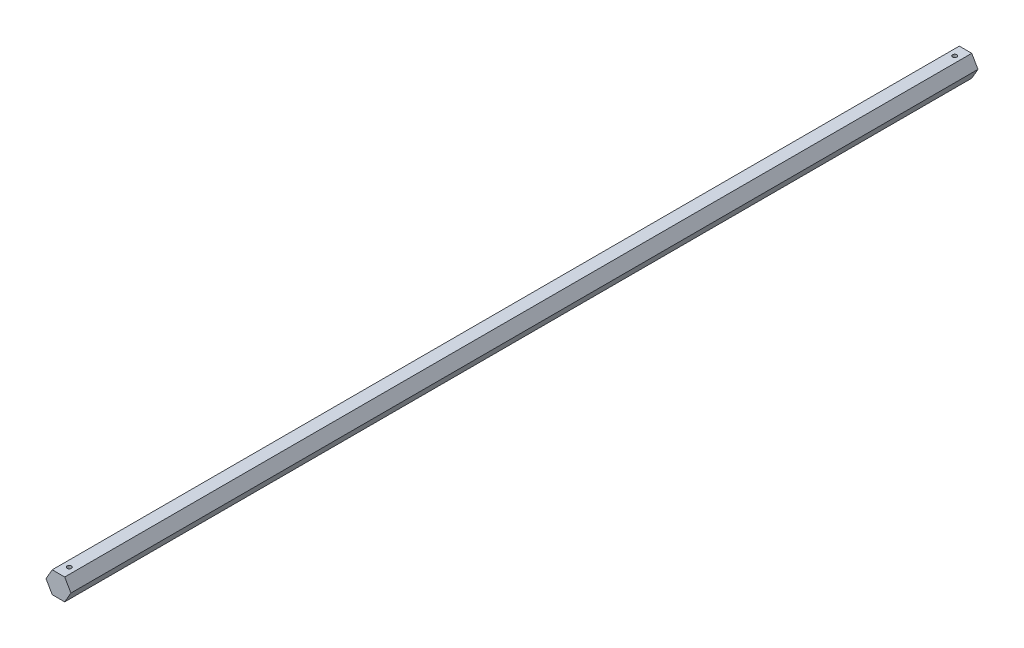
ISO-10303-21;
HEADER;
FILE_DESCRIPTION(('STEP AP214'),'2;1');
FILE_NAME('part.step','',(''),(''),'','','');
FILE_SCHEMA(('AUTOMOTIVE_DESIGN { 1 0 10303 214 1 1 1 1 }'));
ENDSEC;
DATA;
#1=APPLICATION_CONTEXT('core data for automotive mechanical design processes');
#2=APPLICATION_PROTOCOL_DEFINITION('international standard','automotive_design',2000,#1);
#3=PRODUCT_CONTEXT('',#1,'mechanical');
#4=PRODUCT('Part','Part','',(#3));
#5=PRODUCT_RELATED_PRODUCT_CATEGORY('part','',(#4));
#6=PRODUCT_DEFINITION_FORMATION('','',#4);
#7=PRODUCT_DEFINITION_CONTEXT('part definition',#1,'design');
#8=PRODUCT_DEFINITION('design','',#6,#7);
#9=PRODUCT_DEFINITION_SHAPE('','',#8);
#10=(LENGTH_UNIT() NAMED_UNIT(*) SI_UNIT(.MILLI.,.METRE.));
#11=(NAMED_UNIT(*) PLANE_ANGLE_UNIT() SI_UNIT($,.RADIAN.));
#12=(NAMED_UNIT(*) SI_UNIT($,.STERADIAN.) SOLID_ANGLE_UNIT());
#13=UNCERTAINTY_MEASURE_WITH_UNIT(LENGTH_MEASURE(1.E-05),#10,'distance_accuracy_value','');
#14=(GEOMETRIC_REPRESENTATION_CONTEXT(3) GLOBAL_UNCERTAINTY_ASSIGNED_CONTEXT((#13)) GLOBAL_UNIT_ASSIGNED_CONTEXT((#10,
#11,#12)) REPRESENTATION_CONTEXT('',''));
#15=CARTESIAN_POINT('',(0.,0.,0.));
#16=DIRECTION('',(0.,0.,1.));
#17=DIRECTION('',(1.,0.,0.));
#18=AXIS2_PLACEMENT_3D('',#15,#16,#17);
#19=CARTESIAN_POINT('',(-3.66617420935412,-6.35,266.7));
#20=DIRECTION('',(0.,1.,0.));
#21=DIRECTION('',(-1.,0.,0.));
#22=AXIS2_PLACEMENT_3D('',#19,#20,#21);
#23=PLANE('',#22);
#24=CARTESIAN_POINT('',(0.,-6.35,260.35));
#25=DIRECTION('',(0.,1.,0.));
#26=DIRECTION('',(-1.,0.,0.));
#27=AXIS2_PLACEMENT_3D('',#24,#25,#26);
#28=CIRCLE('',#27,1.2573);
#29=CARTESIAN_POINT('',(-1.2573,-6.35,260.35));
#30=VERTEX_POINT('',#29);
#31=EDGE_CURVE('E123',#30,#30,#28,.T.);
#32=ORIENTED_EDGE('',*,*,#31,.T.);
#33=EDGE_LOOP('',(#32));
#34=FACE_BOUND('',#33,.T.);
#35=CARTESIAN_POINT('',(0.,-6.35,-260.35));
#36=DIRECTION('',(0.,1.,0.));
#37=DIRECTION('',(1.,0.,0.));
#38=AXIS2_PLACEMENT_3D('',#35,#36,#37);
#39=CIRCLE('',#38,1.2573);
#40=CARTESIAN_POINT('',(-1.2573,-6.35,-260.35));
#41=VERTEX_POINT('',#40);
#42=EDGE_CURVE('E164',#41,#41,#39,.T.);
#43=ORIENTED_EDGE('',*,*,#42,.T.);
#44=EDGE_LOOP('',(#43));
#45=FACE_BOUND('',#44,.T.);
#46=DIRECTION('',(1.,0.,0.));
#47=VECTOR('',#46,1.);
#48=CARTESIAN_POINT('',(-3.66617420935412,-6.35,-266.7));
#49=LINE('',#48,#47);
#50=CARTESIAN_POINT('',(-3.66617420935412,-6.35,-266.7));
#51=VERTEX_POINT('',#50);
#52=CARTESIAN_POINT('',(3.66617420935412,-6.35,-266.7));
#53=VERTEX_POINT('',#52);
#54=EDGE_CURVE('E119',#51,#53,#49,.T.);
#55=ORIENTED_EDGE('',*,*,#54,.T.);
#56=DIRECTION('',(0.,0.,-1.));
#57=VECTOR('',#56,1.);
#58=CARTESIAN_POINT('',(3.66617420935412,-6.35,266.7));
#59=LINE('',#58,#57);
#60=CARTESIAN_POINT('',(3.66617420935412,-6.35,266.7));
#61=VERTEX_POINT('',#60);
#62=EDGE_CURVE('E11',#61,#53,#59,.T.);
#63=ORIENTED_EDGE('',*,*,#62,.F.);
#64=DIRECTION('',(1.,0.,0.));
#65=VECTOR('',#64,1.);
#66=CARTESIAN_POINT('',(-3.66617420935412,-6.35,266.7));
#67=LINE('',#66,#65);
#68=CARTESIAN_POINT('',(-3.66617420935412,-6.35,266.7));
#69=VERTEX_POINT('',#68);
#70=EDGE_CURVE('E130',#69,#61,#67,.T.);
#71=ORIENTED_EDGE('',*,*,#70,.F.);
#72=DIRECTION('',(0.,0.,-1.));
#73=VECTOR('',#72,1.);
#74=CARTESIAN_POINT('',(-3.66617420935412,-6.35,266.7));
#75=LINE('',#74,#73);
#76=EDGE_CURVE('E115',#69,#51,#75,.T.);
#77=ORIENTED_EDGE('',*,*,#76,.T.);
#78=EDGE_LOOP('',(#55,#63,#71,#77));
#79=FACE_BOUND('',#78,.T.);
#80=ADVANCED_FACE('F35',(#34,#45,#79),#23,.F.);
#81=CARTESIAN_POINT('',(3.66617420935412,-6.35,266.7));
#82=DIRECTION('',(-0.866025403784439,0.5,0.));
#83=DIRECTION('',(-0.5,-0.866025403784438,0.));
#84=AXIS2_PLACEMENT_3D('',#81,#82,#83);
#85=PLANE('',#84);
#86=DIRECTION('',(0.5,0.866025403784438,0.));
#87=VECTOR('',#86,1.);
#88=CARTESIAN_POINT('',(3.66617420935412,-6.35,-266.7));
#89=LINE('',#88,#87);
#90=CARTESIAN_POINT('',(7.33234841870825,0.,-266.7));
#91=VERTEX_POINT('',#90);
#92=EDGE_CURVE('E122',#53,#91,#89,.T.);
#93=ORIENTED_EDGE('',*,*,#92,.T.);
#94=DIRECTION('',(0.,0.,-1.));
#95=VECTOR('',#94,1.);
#96=CARTESIAN_POINT('',(7.33234841870825,0.,266.7));
#97=LINE('',#96,#95);
#98=CARTESIAN_POINT('',(7.33234841870825,0.,266.7));
#99=VERTEX_POINT('',#98);
#100=EDGE_CURVE('E43',#99,#91,#97,.T.);
#101=ORIENTED_EDGE('',*,*,#100,.F.);
#102=DIRECTION('',(0.5,0.866025403784438,0.));
#103=VECTOR('',#102,1.);
#104=CARTESIAN_POINT('',(3.66617420935412,-6.35,266.7));
#105=LINE('',#104,#103);
#106=EDGE_CURVE('E88',#61,#99,#105,.T.);
#107=ORIENTED_EDGE('',*,*,#106,.F.);
#108=ORIENTED_EDGE('',*,*,#62,.T.);
#109=EDGE_LOOP('',(#93,#101,#107,#108));
#110=FACE_BOUND('',#109,.T.);
#111=ADVANCED_FACE('F154',(#110),#85,.F.);
#112=CARTESIAN_POINT('',(7.33234841870825,0.,266.7));
#113=DIRECTION('',(-0.866025403784438,-0.5,0.));
#114=DIRECTION('',(0.5,-0.866025403784439,0.));
#115=AXIS2_PLACEMENT_3D('',#112,#113,#114);
#116=PLANE('',#115);
#117=DIRECTION('',(-0.5,0.866025403784438,0.));
#118=VECTOR('',#117,1.);
#119=CARTESIAN_POINT('',(7.33234841870825,0.,-266.7));
#120=LINE('',#119,#118);
#121=CARTESIAN_POINT('',(3.66617420935412,6.35,-266.7));
#122=VERTEX_POINT('',#121);
#123=EDGE_CURVE('E125',#91,#122,#120,.T.);
#124=ORIENTED_EDGE('',*,*,#123,.T.);
#125=DIRECTION('',(0.,0.,-1.));
#126=VECTOR('',#125,1.);
#127=CARTESIAN_POINT('',(3.66617420935412,6.35,266.7));
#128=LINE('',#127,#126);
#129=CARTESIAN_POINT('',(3.66617420935412,6.35,266.7));
#130=VERTEX_POINT('',#129);
#131=EDGE_CURVE('E110',#130,#122,#128,.T.);
#132=ORIENTED_EDGE('',*,*,#131,.F.);
#133=DIRECTION('',(-0.5,0.866025403784438,0.));
#134=VECTOR('',#133,1.);
#135=CARTESIAN_POINT('',(7.33234841870825,0.,266.7));
#136=LINE('',#135,#134);
#137=EDGE_CURVE('E101',#99,#130,#136,.T.);
#138=ORIENTED_EDGE('',*,*,#137,.F.);
#139=ORIENTED_EDGE('',*,*,#100,.T.);
#140=EDGE_LOOP('',(#124,#132,#138,#139));
#141=FACE_BOUND('',#140,.T.);
#142=ADVANCED_FACE('F136',(#141),#116,.F.);
#143=CARTESIAN_POINT('',(3.66617420935412,6.35,266.7));
#144=DIRECTION('',(0.,-1.,0.));
#145=DIRECTION('',(0.,0.,-1.));
#146=AXIS2_PLACEMENT_3D('',#143,#144,#145);
#147=PLANE('',#146);
#148=CARTESIAN_POINT('',(0.,6.35,260.35));
#149=DIRECTION('',(0.,1.,0.));
#150=DIRECTION('',(-1.,0.,0.));
#151=AXIS2_PLACEMENT_3D('',#148,#149,#150);
#152=CIRCLE('',#151,1.2573);
#153=CARTESIAN_POINT('',(-1.2573,6.35,260.35));
#154=VERTEX_POINT('',#153);
#155=EDGE_CURVE('E166',#154,#154,#152,.T.);
#156=ORIENTED_EDGE('',*,*,#155,.F.);
#157=EDGE_LOOP('',(#156));
#158=FACE_BOUND('',#157,.T.);
#159=CARTESIAN_POINT('',(0.,6.35,-260.35));
#160=DIRECTION('',(0.,1.,0.));
#161=DIRECTION('',(1.,0.,0.));
#162=AXIS2_PLACEMENT_3D('',#159,#160,#161);
#163=CIRCLE('',#162,1.2573);
#164=CARTESIAN_POINT('',(-1.2573,6.35,-260.35));
#165=VERTEX_POINT('',#164);
#166=EDGE_CURVE('E167',#165,#165,#163,.T.);
#167=ORIENTED_EDGE('',*,*,#166,.F.);
#168=EDGE_LOOP('',(#167));
#169=FACE_BOUND('',#168,.T.);
#170=DIRECTION('',(-1.,0.,0.));
#171=VECTOR('',#170,1.);
#172=CARTESIAN_POINT('',(3.66617420935412,6.35,-266.7));
#173=LINE('',#172,#171);
#174=CARTESIAN_POINT('',(-3.66617420935412,6.35,-266.7));
#175=VERTEX_POINT('',#174);
#176=EDGE_CURVE('E109',#122,#175,#173,.T.);
#177=ORIENTED_EDGE('',*,*,#176,.T.);
#178=DIRECTION('',(0.,0.,-1.));
#179=VECTOR('',#178,1.);
#180=CARTESIAN_POINT('',(-3.66617420935412,6.35,266.7));
#181=LINE('',#180,#179);
#182=CARTESIAN_POINT('',(-3.66617420935412,6.35,266.7));
#183=VERTEX_POINT('',#182);
#184=EDGE_CURVE('E106',#183,#175,#181,.T.);
#185=ORIENTED_EDGE('',*,*,#184,.F.);
#186=DIRECTION('',(-1.,0.,0.));
#187=VECTOR('',#186,1.);
#188=CARTESIAN_POINT('',(3.66617420935412,6.35,266.7));
#189=LINE('',#188,#187);
#190=EDGE_CURVE('E95',#130,#183,#189,.T.);
#191=ORIENTED_EDGE('',*,*,#190,.F.);
#192=ORIENTED_EDGE('',*,*,#131,.T.);
#193=EDGE_LOOP('',(#177,#185,#191,#192));
#194=FACE_BOUND('',#193,.T.);
#195=ADVANCED_FACE('F107',(#158,#169,#194),#147,.F.);
#196=CARTESIAN_POINT('',(-3.66617420935412,6.35,266.7));
#197=DIRECTION('',(0.866025403784439,-0.5,0.));
#198=DIRECTION('',(0.5,0.866025403784439,0.));
#199=AXIS2_PLACEMENT_3D('',#196,#197,#198);
#200=PLANE('',#199);
#201=DIRECTION('',(-0.5,-0.866025403784439,0.));
#202=VECTOR('',#201,1.);
#203=CARTESIAN_POINT('',(-3.66617420935412,6.35,-266.7));
#204=LINE('',#203,#202);
#205=CARTESIAN_POINT('',(-7.33234841870825,0.,-266.7));
#206=VERTEX_POINT('',#205);
#207=EDGE_CURVE('E74',#175,#206,#204,.T.);
#208=ORIENTED_EDGE('',*,*,#207,.T.);
#209=DIRECTION('',(0.,0.,-1.));
#210=VECTOR('',#209,1.);
#211=CARTESIAN_POINT('',(-7.33234841870825,0.,266.7));
#212=LINE('',#211,#210);
#213=CARTESIAN_POINT('',(-7.33234841870825,0.,266.7));
#214=VERTEX_POINT('',#213);
#215=EDGE_CURVE('E111',#214,#206,#212,.T.);
#216=ORIENTED_EDGE('',*,*,#215,.F.);
#217=DIRECTION('',(-0.5,-0.866025403784439,0.));
#218=VECTOR('',#217,1.);
#219=CARTESIAN_POINT('',(-3.66617420935412,6.35,266.7));
#220=LINE('',#219,#218);
#221=EDGE_CURVE('E99',#183,#214,#220,.T.);
#222=ORIENTED_EDGE('',*,*,#221,.F.);
#223=ORIENTED_EDGE('',*,*,#184,.T.);
#224=EDGE_LOOP('',(#208,#216,#222,#223));
#225=FACE_BOUND('',#224,.T.);
#226=ADVANCED_FACE('F113',(#225),#200,.F.);
#227=CARTESIAN_POINT('',(-7.33234841870825,0.,266.7));
#228=DIRECTION('',(0.866025403784439,0.5,0.));
#229=DIRECTION('',(-0.5,0.866025403784438,0.));
#230=AXIS2_PLACEMENT_3D('',#227,#228,#229);
#231=PLANE('',#230);
#232=DIRECTION('',(0.5,-0.866025403784438,0.));
#233=VECTOR('',#232,1.);
#234=CARTESIAN_POINT('',(-7.33234841870825,0.,-266.7));
#235=LINE('',#234,#233);
#236=EDGE_CURVE('E80',#206,#51,#235,.T.);
#237=ORIENTED_EDGE('',*,*,#236,.T.);
#238=ORIENTED_EDGE('',*,*,#76,.F.);
#239=DIRECTION('',(0.5,-0.866025403784438,0.));
#240=VECTOR('',#239,1.);
#241=CARTESIAN_POINT('',(-7.33234841870825,0.,266.7));
#242=LINE('',#241,#240);
#243=EDGE_CURVE('E51',#214,#69,#242,.T.);
#244=ORIENTED_EDGE('',*,*,#243,.F.);
#245=ORIENTED_EDGE('',*,*,#215,.T.);
#246=EDGE_LOOP('',(#237,#238,#244,#245));
#247=FACE_BOUND('',#246,.T.);
#248=ADVANCED_FACE('F143',(#247),#231,.F.);
#249=CARTESIAN_POINT('',(0.,0.,266.7));
#250=DIRECTION('',(0.,0.,1.));
#251=DIRECTION('',(1.,0.,0.));
#252=AXIS2_PLACEMENT_3D('',#249,#250,#251);
#253=PLANE('',#252);
#254=ORIENTED_EDGE('',*,*,#70,.T.);
#255=ORIENTED_EDGE('',*,*,#106,.T.);
#256=ORIENTED_EDGE('',*,*,#137,.T.);
#257=ORIENTED_EDGE('',*,*,#190,.T.);
#258=ORIENTED_EDGE('',*,*,#221,.T.);
#259=ORIENTED_EDGE('',*,*,#243,.T.);
#260=EDGE_LOOP('',(#254,#255,#256,#257,#258,#259));
#261=FACE_BOUND('',#260,.T.);
#262=ADVANCED_FACE('F97',(#261),#253,.T.);
#263=CARTESIAN_POINT('',(0.,0.,-266.7));
#264=DIRECTION('',(0.,0.,1.));
#265=DIRECTION('',(1.,0.,0.));
#266=AXIS2_PLACEMENT_3D('',#263,#264,#265);
#267=PLANE('',#266);
#268=ORIENTED_EDGE('',*,*,#54,.F.);
#269=ORIENTED_EDGE('',*,*,#236,.F.);
#270=ORIENTED_EDGE('',*,*,#207,.F.);
#271=ORIENTED_EDGE('',*,*,#176,.F.);
#272=ORIENTED_EDGE('',*,*,#123,.F.);
#273=ORIENTED_EDGE('',*,*,#92,.F.);
#274=EDGE_LOOP('',(#268,#269,#270,#271,#272,#273));
#275=FACE_BOUND('',#274,.T.);
#276=ADVANCED_FACE('F139',(#275),#267,.F.);
#277=CARTESIAN_POINT('',(0.,-6.35,-260.35));
#278=DIRECTION('',(0.,1.,0.));
#279=DIRECTION('',(-1.,0.,0.));
#280=AXIS2_PLACEMENT_3D('',#277,#278,#279);
#281=CYLINDRICAL_SURFACE('',#280,1.2573);
#282=CARTESIAN_POINT('',(-1.2573,-6.35,-260.35));
#283=CARTESIAN_POINT('',(-1.2573,-6.21770833333334,-260.35));
#284=CARTESIAN_POINT('',(-1.2573,-6.08541666666667,-260.35));
#285=CARTESIAN_POINT('',(-1.2573,-5.82083333333333,-260.35));
#286=CARTESIAN_POINT('',(-1.2573,-5.68854166666667,-260.35));
#287=CARTESIAN_POINT('',(-1.2573,-5.42395833333333,-260.35));
#288=CARTESIAN_POINT('',(-1.2573,-5.29166666666667,-260.35));
#289=CARTESIAN_POINT('',(-1.2573,-5.02708333333333,-260.35));
#290=CARTESIAN_POINT('',(-1.2573,-4.89479166666667,-260.35));
#291=CARTESIAN_POINT('',(-1.2573,-4.63020833333333,-260.35));
#292=CARTESIAN_POINT('',(-1.2573,-4.49791666666667,-260.35));
#293=CARTESIAN_POINT('',(-1.2573,-4.23333333333333,-260.35));
#294=CARTESIAN_POINT('',(-1.2573,-4.10104166666667,-260.35));
#295=CARTESIAN_POINT('',(-1.2573,-3.83645833333334,-260.35));
#296=CARTESIAN_POINT('',(-1.2573,-3.70416666666667,-260.35));
#297=CARTESIAN_POINT('',(-1.2573,-3.43958333333333,-260.35));
#298=CARTESIAN_POINT('',(-1.2573,-3.30729166666667,-260.35));
#299=CARTESIAN_POINT('',(-1.2573,-3.04270833333333,-260.35));
#300=CARTESIAN_POINT('',(-1.2573,-2.91041666666667,-260.35));
#301=CARTESIAN_POINT('',(-1.2573,-2.64583333333334,-260.35));
#302=CARTESIAN_POINT('',(-1.2573,-2.51354166666667,-260.35));
#303=CARTESIAN_POINT('',(-1.2573,-2.24895833333334,-260.35));
#304=CARTESIAN_POINT('',(-1.2573,-2.11666666666667,-260.35));
#305=CARTESIAN_POINT('',(-1.2573,-1.85208333333334,-260.35));
#306=CARTESIAN_POINT('',(-1.2573,-1.71979166666667,-260.35));
#307=CARTESIAN_POINT('',(-1.2573,-1.45520833333334,-260.35));
#308=CARTESIAN_POINT('',(-1.2573,-1.32291666666667,-260.35));
#309=CARTESIAN_POINT('',(-1.2573,-1.05833333333334,-260.35));
#310=CARTESIAN_POINT('',(-1.2573,-0.926041666666669,-260.35));
#311=CARTESIAN_POINT('',(-1.2573,-0.661458333333335,-260.35));
#312=CARTESIAN_POINT('',(-1.2573,-0.529166666666668,-260.35));
#313=CARTESIAN_POINT('',(-1.2573,-0.264583333333335,-260.35));
#314=CARTESIAN_POINT('',(-1.2573,-0.132291666666668,-260.35));
#315=CARTESIAN_POINT('',(-1.2573,0.132291666666665,-260.35));
#316=CARTESIAN_POINT('',(-1.2573,0.264583333333331,-260.35));
#317=CARTESIAN_POINT('',(-1.2573,0.529166666666665,-260.35));
#318=CARTESIAN_POINT('',(-1.2573,0.661458333333332,-260.35));
#319=CARTESIAN_POINT('',(-1.2573,0.926041666666665,-260.35));
#320=CARTESIAN_POINT('',(-1.2573,1.05833333333333,-260.35));
#321=CARTESIAN_POINT('',(-1.2573,1.32291666666667,-260.35));
#322=CARTESIAN_POINT('',(-1.2573,1.45520833333333,-260.35));
#323=CARTESIAN_POINT('',(-1.2573,1.71979166666667,-260.35));
#324=CARTESIAN_POINT('',(-1.2573,1.85208333333333,-260.35));
#325=CARTESIAN_POINT('',(-1.2573,2.11666666666667,-260.35));
#326=CARTESIAN_POINT('',(-1.2573,2.24895833333333,-260.35));
#327=CARTESIAN_POINT('',(-1.2573,2.51354166666667,-260.35));
#328=CARTESIAN_POINT('',(-1.2573,2.64583333333333,-260.35));
#329=CARTESIAN_POINT('',(-1.2573,2.91041666666667,-260.35));
#330=CARTESIAN_POINT('',(-1.2573,3.04270833333333,-260.35));
#331=CARTESIAN_POINT('',(-1.2573,3.30729166666667,-260.35));
#332=CARTESIAN_POINT('',(-1.2573,3.43958333333333,-260.35));
#333=CARTESIAN_POINT('',(-1.2573,3.70416666666667,-260.35));
#334=CARTESIAN_POINT('',(-1.2573,3.83645833333333,-260.35));
#335=CARTESIAN_POINT('',(-1.2573,4.10104166666667,-260.35));
#336=CARTESIAN_POINT('',(-1.2573,4.23333333333333,-260.35));
#337=CARTESIAN_POINT('',(-1.2573,4.49791666666667,-260.35));
#338=CARTESIAN_POINT('',(-1.2573,4.63020833333333,-260.35));
#339=CARTESIAN_POINT('',(-1.2573,4.89479166666667,-260.35));
#340=CARTESIAN_POINT('',(-1.2573,5.02708333333333,-260.35));
#341=CARTESIAN_POINT('',(-1.2573,5.29166666666667,-260.35));
#342=CARTESIAN_POINT('',(-1.2573,5.42395833333333,-260.35));
#343=CARTESIAN_POINT('',(-1.2573,5.68854166666667,-260.35));
#344=CARTESIAN_POINT('',(-1.2573,5.82083333333333,-260.35));
#345=CARTESIAN_POINT('',(-1.2573,6.08541666666667,-260.35));
#346=CARTESIAN_POINT('',(-1.2573,6.21770833333333,-260.35));
#347=CARTESIAN_POINT('',(-1.2573,6.35,-260.35));
#348=B_SPLINE_CURVE_WITH_KNOTS('',3,(#282,#283,#284,#285,#286,#287,#288,#289,#290,#291,#292,
#293,#294,#295,#296,#297,#298,#299,#300,#301,#302,#303,#304,#305,#306,#307,#308,#309,#310,#311,
#312,#313,#314,#315,#316,#317,#318,#319,#320,#321,#322,#323,#324,#325,#326,#327,#328,#329,#330,
#331,#332,#333,#334,#335,#336,#337,#338,#339,#340,#341,#342,#343,#344,#345,#346,#347),
.UNSPECIFIED.,.F.,.F.,(4,2,2,2,2,2,2,2,2,2,2,2,2,2,2,2,2,2,2,2,2,2,2,2,2,2,2,2,2,2,2,2,4),(0.,
0.396875000000001,0.79375,1.190625,1.5875,1.984375,2.38125,2.778125,3.175,3.571875,3.96875,
4.365625,4.7625,5.159375,5.55625,5.953125,6.35,6.746875,7.14375,7.540625,7.9375,8.334375,
8.73125,9.128125,9.525,9.921875,10.31875,10.715625,11.1125,11.509375,11.90625,12.303125,12.7),.UNSPECIFIED.);
#349=EDGE_CURVE('BSEAM178',#41,#165,#348,.T.);
#350=ORIENTED_EDGE('',*,*,#42,.F.);
#351=ORIENTED_EDGE('',*,*,#166,.T.);
#352=ORIENTED_EDGE('',*,*,#349,.T.);
#353=ORIENTED_EDGE('',*,*,#349,.F.);
#354=EDGE_LOOP('',(#350,#352,#351,#353));
#355=FACE_BOUND('',#354,.T.);
#356=ADVANCED_FACE('F178',(#355),#281,.F.);
#357=CARTESIAN_POINT('',(0.,-6.35,260.35));
#358=DIRECTION('',(0.,1.,0.));
#359=DIRECTION('',(-1.,0.,0.));
#360=AXIS2_PLACEMENT_3D('',#357,#358,#359);
#361=CYLINDRICAL_SURFACE('',#360,1.2573);
#362=CARTESIAN_POINT('',(-1.2573,-6.35,260.35));
#363=CARTESIAN_POINT('',(-1.2573,-6.21770833333334,260.35));
#364=CARTESIAN_POINT('',(-1.2573,-6.08541666666667,260.35));
#365=CARTESIAN_POINT('',(-1.2573,-5.82083333333333,260.35));
#366=CARTESIAN_POINT('',(-1.2573,-5.68854166666667,260.35));
#367=CARTESIAN_POINT('',(-1.2573,-5.42395833333333,260.35));
#368=CARTESIAN_POINT('',(-1.2573,-5.29166666666667,260.35));
#369=CARTESIAN_POINT('',(-1.2573,-5.02708333333333,260.35));
#370=CARTESIAN_POINT('',(-1.2573,-4.89479166666667,260.35));
#371=CARTESIAN_POINT('',(-1.2573,-4.63020833333333,260.35));
#372=CARTESIAN_POINT('',(-1.2573,-4.49791666666667,260.35));
#373=CARTESIAN_POINT('',(-1.2573,-4.23333333333333,260.35));
#374=CARTESIAN_POINT('',(-1.2573,-4.10104166666667,260.35));
#375=CARTESIAN_POINT('',(-1.2573,-3.83645833333334,260.35));
#376=CARTESIAN_POINT('',(-1.2573,-3.70416666666667,260.35));
#377=CARTESIAN_POINT('',(-1.2573,-3.43958333333333,260.35));
#378=CARTESIAN_POINT('',(-1.2573,-3.30729166666667,260.35));
#379=CARTESIAN_POINT('',(-1.2573,-3.04270833333333,260.35));
#380=CARTESIAN_POINT('',(-1.2573,-2.91041666666667,260.35));
#381=CARTESIAN_POINT('',(-1.2573,-2.64583333333334,260.35));
#382=CARTESIAN_POINT('',(-1.2573,-2.51354166666667,260.35));
#383=CARTESIAN_POINT('',(-1.2573,-2.24895833333334,260.35));
#384=CARTESIAN_POINT('',(-1.2573,-2.11666666666667,260.35));
#385=CARTESIAN_POINT('',(-1.2573,-1.85208333333334,260.35));
#386=CARTESIAN_POINT('',(-1.2573,-1.71979166666667,260.35));
#387=CARTESIAN_POINT('',(-1.2573,-1.45520833333334,260.35));
#388=CARTESIAN_POINT('',(-1.2573,-1.32291666666667,260.35));
#389=CARTESIAN_POINT('',(-1.2573,-1.05833333333334,260.35));
#390=CARTESIAN_POINT('',(-1.2573,-0.926041666666669,260.35));
#391=CARTESIAN_POINT('',(-1.2573,-0.661458333333335,260.35));
#392=CARTESIAN_POINT('',(-1.2573,-0.529166666666668,260.35));
#393=CARTESIAN_POINT('',(-1.2573,-0.264583333333335,260.35));
#394=CARTESIAN_POINT('',(-1.2573,-0.132291666666668,260.35));
#395=CARTESIAN_POINT('',(-1.2573,0.132291666666665,260.35));
#396=CARTESIAN_POINT('',(-1.2573,0.264583333333331,260.35));
#397=CARTESIAN_POINT('',(-1.2573,0.529166666666665,260.35));
#398=CARTESIAN_POINT('',(-1.2573,0.661458333333332,260.35));
#399=CARTESIAN_POINT('',(-1.2573,0.926041666666665,260.35));
#400=CARTESIAN_POINT('',(-1.2573,1.05833333333333,260.35));
#401=CARTESIAN_POINT('',(-1.2573,1.32291666666667,260.35));
#402=CARTESIAN_POINT('',(-1.2573,1.45520833333333,260.35));
#403=CARTESIAN_POINT('',(-1.2573,1.71979166666667,260.35));
#404=CARTESIAN_POINT('',(-1.2573,1.85208333333333,260.35));
#405=CARTESIAN_POINT('',(-1.2573,2.11666666666667,260.35));
#406=CARTESIAN_POINT('',(-1.2573,2.24895833333333,260.35));
#407=CARTESIAN_POINT('',(-1.2573,2.51354166666667,260.35));
#408=CARTESIAN_POINT('',(-1.2573,2.64583333333333,260.35));
#409=CARTESIAN_POINT('',(-1.2573,2.91041666666667,260.35));
#410=CARTESIAN_POINT('',(-1.2573,3.04270833333333,260.35));
#411=CARTESIAN_POINT('',(-1.2573,3.30729166666667,260.35));
#412=CARTESIAN_POINT('',(-1.2573,3.43958333333333,260.35));
#413=CARTESIAN_POINT('',(-1.2573,3.70416666666667,260.35));
#414=CARTESIAN_POINT('',(-1.2573,3.83645833333333,260.35));
#415=CARTESIAN_POINT('',(-1.2573,4.10104166666667,260.35));
#416=CARTESIAN_POINT('',(-1.2573,4.23333333333333,260.35));
#417=CARTESIAN_POINT('',(-1.2573,4.49791666666667,260.35));
#418=CARTESIAN_POINT('',(-1.2573,4.63020833333333,260.35));
#419=CARTESIAN_POINT('',(-1.2573,4.89479166666667,260.35));
#420=CARTESIAN_POINT('',(-1.2573,5.02708333333333,260.35));
#421=CARTESIAN_POINT('',(-1.2573,5.29166666666667,260.35));
#422=CARTESIAN_POINT('',(-1.2573,5.42395833333333,260.35));
#423=CARTESIAN_POINT('',(-1.2573,5.68854166666667,260.35));
#424=CARTESIAN_POINT('',(-1.2573,5.82083333333333,260.35));
#425=CARTESIAN_POINT('',(-1.2573,6.08541666666667,260.35));
#426=CARTESIAN_POINT('',(-1.2573,6.21770833333333,260.35));
#427=CARTESIAN_POINT('',(-1.2573,6.35,260.35));
#428=B_SPLINE_CURVE_WITH_KNOTS('',3,(#362,#363,#364,#365,#366,#367,#368,#369,#370,#371,#372,
#373,#374,#375,#376,#377,#378,#379,#380,#381,#382,#383,#384,#385,#386,#387,#388,#389,#390,#391,
#392,#393,#394,#395,#396,#397,#398,#399,#400,#401,#402,#403,#404,#405,#406,#407,#408,#409,#410,
#411,#412,#413,#414,#415,#416,#417,#418,#419,#420,#421,#422,#423,#424,#425,#426,#427),
.UNSPECIFIED.,.F.,.F.,(4,2,2,2,2,2,2,2,2,2,2,2,2,2,2,2,2,2,2,2,2,2,2,2,2,2,2,2,2,2,2,2,4),(0.,
0.396875000000001,0.79375,1.190625,1.5875,1.984375,2.38125,2.778125,3.175,3.571875,3.96875,
4.365625,4.7625,5.159375,5.55625,5.953125,6.35,6.746875,7.14375,7.540625,7.9375,8.334375,
8.73125,9.128125,9.525,9.921875,10.31875,10.715625,11.1125,11.509375,11.90625,12.303125,12.7),.UNSPECIFIED.);
#429=EDGE_CURVE('BSEAM189',#30,#154,#428,.T.);
#430=ORIENTED_EDGE('',*,*,#31,.F.);
#431=ORIENTED_EDGE('',*,*,#155,.T.);
#432=ORIENTED_EDGE('',*,*,#429,.T.);
#433=ORIENTED_EDGE('',*,*,#429,.F.);
#434=EDGE_LOOP('',(#430,#432,#431,#433));
#435=FACE_BOUND('',#434,.T.);
#436=ADVANCED_FACE('F189',(#435),#361,.F.);
#437=CLOSED_SHELL('',(#80,#111,#142,#195,#226,#248,#262,#276,#356,#436));
#438=MANIFOLD_SOLID_BREP('B2',#437);
#439=ADVANCED_BREP_SHAPE_REPRESENTATION('',(#18,#438),#14);
#440=SHAPE_DEFINITION_REPRESENTATION(#9,#439);
ENDSEC;
END-ISO-10303-21;
